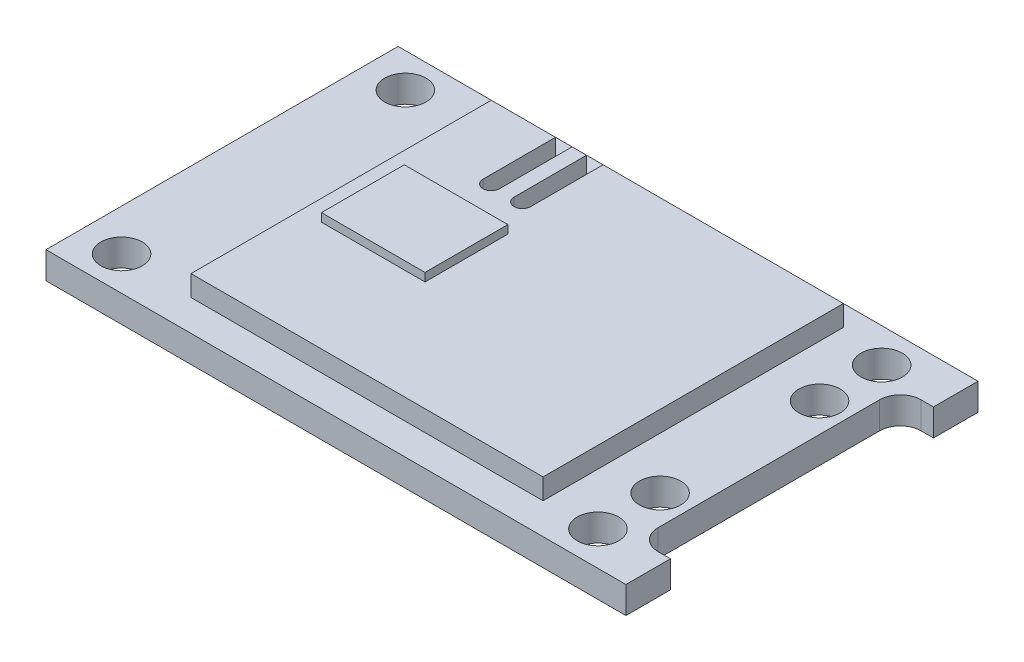
ISO-10303-21;
HEADER;
FILE_DESCRIPTION(('STEP AP214'),'2;1');
FILE_NAME('part.step','',(''),(''),'','','');
FILE_SCHEMA(('AUTOMOTIVE_DESIGN { 1 0 10303 214 1 1 1 1 }'));
ENDSEC;
DATA;
#1=APPLICATION_CONTEXT('core data for automotive mechanical design processes');
#2=APPLICATION_PROTOCOL_DEFINITION('international standard','automotive_design',2000,#1);
#3=PRODUCT_CONTEXT('',#1,'mechanical');
#4=PRODUCT('Part','Part','',(#3));
#5=PRODUCT_RELATED_PRODUCT_CATEGORY('part','',(#4));
#6=PRODUCT_DEFINITION_FORMATION('','',#4);
#7=PRODUCT_DEFINITION_CONTEXT('part definition',#1,'design');
#8=PRODUCT_DEFINITION('design','',#6,#7);
#9=PRODUCT_DEFINITION_SHAPE('','',#8);
#10=(LENGTH_UNIT() NAMED_UNIT(*) SI_UNIT(.MILLI.,.METRE.));
#11=(NAMED_UNIT(*) PLANE_ANGLE_UNIT() SI_UNIT($,.RADIAN.));
#12=(NAMED_UNIT(*) SI_UNIT($,.STERADIAN.) SOLID_ANGLE_UNIT());
#13=UNCERTAINTY_MEASURE_WITH_UNIT(LENGTH_MEASURE(1.E-05),#10,'distance_accuracy_value','');
#14=(GEOMETRIC_REPRESENTATION_CONTEXT(3) GLOBAL_UNCERTAINTY_ASSIGNED_CONTEXT((#13)) GLOBAL_UNIT_ASSIGNED_CONTEXT((#10,
#11,#12)) REPRESENTATION_CONTEXT('',''));
#15=CARTESIAN_POINT('',(0.,0.,0.));
#16=DIRECTION('',(0.,0.,1.));
#17=DIRECTION('',(1.,0.,0.));
#18=AXIS2_PLACEMENT_3D('',#15,#16,#17);
#19=CARTESIAN_POINT('',(-5.,2.3,-4.));
#20=DIRECTION('',(0.,1.,0.));
#21=DIRECTION('',(0.,0.,1.));
#22=AXIS2_PLACEMENT_3D('',#19,#20,#21);
#23=PLANE('',#22);
#24=DIRECTION('',(0.,0.,-1.));
#25=VECTOR('',#24,1.);
#26=CARTESIAN_POINT('',(8.50000000000001,2.3,-7.5));
#27=LINE('',#26,#25);
#28=CARTESIAN_POINT('',(8.5,2.3,7.));
#29=VERTEX_POINT('',#28);
#30=CARTESIAN_POINT('',(8.50000000000001,2.3,-7.5));
#31=VERTEX_POINT('',#30);
#32=EDGE_CURVE('E243',#29,#31,#27,.T.);
#33=ORIENTED_EDGE('',*,*,#32,.T.);
#34=DIRECTION('',(-1.,0.,0.));
#35=VECTOR('',#34,1.);
#36=CARTESIAN_POINT('',(-3.1,2.3,-7.5));
#37=LINE('',#36,#35);
#38=CARTESIAN_POINT('',(-3.1,2.3,-7.5));
#39=VERTEX_POINT('',#38);
#40=EDGE_CURVE('E246',#31,#39,#37,.T.);
#41=ORIENTED_EDGE('',*,*,#40,.T.);
#42=DIRECTION('',(0.,0.,1.));
#43=VECTOR('',#42,1.);
#44=CARTESIAN_POINT('',(-3.1,2.3,-4.));
#45=LINE('',#44,#43);
#46=CARTESIAN_POINT('',(-3.1,2.3,-4.));
#47=VERTEX_POINT('',#46);
#48=EDGE_CURVE('E249',#39,#47,#45,.T.);
#49=ORIENTED_EDGE('',*,*,#48,.T.);
#50=CARTESIAN_POINT('',(-3.5,2.3,-4.));
#51=DIRECTION('',(0.,-1.,0.));
#52=DIRECTION('',(0.,0.,1.));
#53=AXIS2_PLACEMENT_3D('',#50,#51,#52);
#54=CIRCLE('',#53,0.4);
#55=CARTESIAN_POINT('',(-3.9,2.3,-4.));
#56=VERTEX_POINT('',#55);
#57=EDGE_CURVE('E251',#47,#56,#54,.T.);
#58=ORIENTED_EDGE('',*,*,#57,.T.);
#59=DIRECTION('',(0.,0.,-1.));
#60=VECTOR('',#59,1.);
#61=CARTESIAN_POINT('',(-3.9,2.3,-4.));
#62=LINE('',#61,#60);
#63=CARTESIAN_POINT('',(-3.9,2.3,-7.5));
#64=VERTEX_POINT('',#63);
#65=EDGE_CURVE('E253',#56,#64,#62,.T.);
#66=ORIENTED_EDGE('',*,*,#65,.T.);
#67=DIRECTION('',(-1.,0.,0.));
#68=VECTOR('',#67,1.);
#69=CARTESIAN_POINT('',(-4.6,2.3,-7.5));
#70=LINE('',#69,#68);
#71=CARTESIAN_POINT('',(-4.6,2.3,-7.5));
#72=VERTEX_POINT('',#71);
#73=EDGE_CURVE('E255',#64,#72,#70,.T.);
#74=ORIENTED_EDGE('',*,*,#73,.T.);
#75=DIRECTION('',(0.,0.,1.));
#76=VECTOR('',#75,1.);
#77=CARTESIAN_POINT('',(-4.6,2.3,-4.));
#78=LINE('',#77,#76);
#79=CARTESIAN_POINT('',(-4.6,2.3,-4.));
#80=VERTEX_POINT('',#79);
#81=EDGE_CURVE('E257',#72,#80,#78,.T.);
#82=ORIENTED_EDGE('',*,*,#81,.T.);
#83=CARTESIAN_POINT('',(-5.,2.3,-4.));
#84=DIRECTION('',(0.,-1.,0.));
#85=DIRECTION('',(0.,0.,1.));
#86=AXIS2_PLACEMENT_3D('',#83,#84,#85);
#87=CIRCLE('',#86,0.400000000000001);
#88=CARTESIAN_POINT('',(-5.4,2.3,-4.));
#89=VERTEX_POINT('',#88);
#90=EDGE_CURVE('E259',#80,#89,#87,.T.);
#91=ORIENTED_EDGE('',*,*,#90,.T.);
#92=DIRECTION('',(0.,0.,-1.));
#93=VECTOR('',#92,1.);
#94=CARTESIAN_POINT('',(-5.4,2.3,-4.));
#95=LINE('',#94,#93);
#96=CARTESIAN_POINT('',(-5.4,2.3,-7.5));
#97=VERTEX_POINT('',#96);
#98=EDGE_CURVE('E261',#89,#97,#95,.T.);
#99=ORIENTED_EDGE('',*,*,#98,.T.);
#100=DIRECTION('',(-1.,0.,0.));
#101=VECTOR('',#100,1.);
#102=CARTESIAN_POINT('',(-8.5,2.3,-7.5));
#103=LINE('',#102,#101);
#104=CARTESIAN_POINT('',(-8.5,2.3,-7.5));
#105=VERTEX_POINT('',#104);
#106=EDGE_CURVE('E263',#97,#105,#103,.T.);
#107=ORIENTED_EDGE('',*,*,#106,.T.);
#108=DIRECTION('',(0.,0.,1.));
#109=VECTOR('',#108,1.);
#110=CARTESIAN_POINT('',(-8.5,2.3,-7.5));
#111=LINE('',#110,#109);
#112=CARTESIAN_POINT('',(-8.49999999999999,2.3,7.));
#113=VERTEX_POINT('',#112);
#114=EDGE_CURVE('E265',#105,#113,#111,.T.);
#115=ORIENTED_EDGE('',*,*,#114,.T.);
#116=DIRECTION('',(1.,0.,0.));
#117=VECTOR('',#116,1.);
#118=CARTESIAN_POINT('',(-8.49999999999999,2.3,7.));
#119=LINE('',#118,#117);
#120=EDGE_CURVE('E267',#113,#29,#119,.T.);
#121=ORIENTED_EDGE('',*,*,#120,.T.);
#122=EDGE_LOOP('',(#33,#41,#49,#58,#66,#74,#82,#91,#99,#107,#115,#121));
#123=FACE_BOUND('',#122,.T.);
#124=DIRECTION('',(-1.,0.,0.));
#125=VECTOR('',#124,1.);
#126=CARTESIAN_POINT('',(-7.5,2.3,-2.3));
#127=LINE('',#126,#125);
#128=CARTESIAN_POINT('',(-2.5,2.3,-2.3));
#129=VERTEX_POINT('',#128);
#130=CARTESIAN_POINT('',(-7.5,2.3,-2.3));
#131=VERTEX_POINT('',#130);
#132=EDGE_CURVE('E880',#129,#131,#127,.T.);
#133=ORIENTED_EDGE('',*,*,#132,.F.);
#134=DIRECTION('',(0.,0.,-1.));
#135=VECTOR('',#134,1.);
#136=CARTESIAN_POINT('',(-2.5,2.3,-2.3));
#137=LINE('',#136,#135);
#138=CARTESIAN_POINT('',(-2.5,2.3,1.7));
#139=VERTEX_POINT('',#138);
#140=EDGE_CURVE('E233',#139,#129,#137,.T.);
#141=ORIENTED_EDGE('',*,*,#140,.F.);
#142=DIRECTION('',(1.,0.,0.));
#143=VECTOR('',#142,1.);
#144=CARTESIAN_POINT('',(-7.5,2.3,1.7));
#145=LINE('',#144,#143);
#146=CARTESIAN_POINT('',(-7.5,2.3,1.7));
#147=VERTEX_POINT('',#146);
#148=EDGE_CURVE('E229',#147,#139,#145,.T.);
#149=ORIENTED_EDGE('',*,*,#148,.F.);
#150=DIRECTION('',(0.,0.,1.));
#151=VECTOR('',#150,1.);
#152=CARTESIAN_POINT('',(-7.5,2.3,-2.3));
#153=LINE('',#152,#151);
#154=EDGE_CURVE('E877',#131,#147,#153,.T.);
#155=ORIENTED_EDGE('',*,*,#154,.F.);
#156=EDGE_LOOP('',(#133,#141,#149,#155));
#157=FACE_BOUND('',#156,.T.);
#158=ADVANCED_FACE('F36',(#123,#157),#23,.T.);
#159=CARTESIAN_POINT('',(13.4,1.3,-5.35));
#160=DIRECTION('',(0.,1.,0.));
#161=DIRECTION('',(0.,0.,1.));
#162=AXIS2_PLACEMENT_3D('',#159,#160,#161);
#163=PLANE('',#162);
#164=CARTESIAN_POINT('',(-12.,1.3,-6.85));
#165=DIRECTION('',(0.,1.,0.));
#166=DIRECTION('',(0.,0.,1.));
#167=AXIS2_PLACEMENT_3D('',#164,#165,#166);
#168=CIRCLE('',#167,1.);
#169=CARTESIAN_POINT('',(-12.,1.3,-5.85));
#170=VERTEX_POINT('',#169);
#171=EDGE_CURVE('E333',#170,#170,#168,.T.);
#172=ORIENTED_EDGE('',*,*,#171,.F.);
#173=EDGE_LOOP('',(#172));
#174=FACE_BOUND('',#173,.T.);
#175=CARTESIAN_POINT('',(-12.,1.3,6.85));
#176=DIRECTION('',(0.,1.,0.));
#177=DIRECTION('',(0.,0.,1.));
#178=AXIS2_PLACEMENT_3D('',#175,#176,#177);
#179=CIRCLE('',#178,1.);
#180=CARTESIAN_POINT('',(-12.,1.3,7.85));
#181=VERTEX_POINT('',#180);
#182=EDGE_CURVE('E339',#181,#181,#179,.T.);
#183=ORIENTED_EDGE('',*,*,#182,.F.);
#184=EDGE_LOOP('',(#183));
#185=FACE_BOUND('',#184,.T.);
#186=CARTESIAN_POINT('',(11.,1.3,6.85));
#187=DIRECTION('',(0.,1.,0.));
#188=DIRECTION('',(0.,0.,1.));
#189=AXIS2_PLACEMENT_3D('',#186,#187,#188);
#190=CIRCLE('',#189,1.);
#191=CARTESIAN_POINT('',(11.,1.3,7.85));
#192=VERTEX_POINT('',#191);
#193=EDGE_CURVE('E345',#192,#192,#190,.T.);
#194=ORIENTED_EDGE('',*,*,#193,.F.);
#195=EDGE_LOOP('',(#194));
#196=FACE_BOUND('',#195,.T.);
#197=CARTESIAN_POINT('',(11.,1.3,3.85));
#198=DIRECTION('',(0.,1.,0.));
#199=DIRECTION('',(0.,0.,1.));
#200=AXIS2_PLACEMENT_3D('',#197,#198,#199);
#201=CIRCLE('',#200,1.);
#202=CARTESIAN_POINT('',(11.,1.3,4.85));
#203=VERTEX_POINT('',#202);
#204=EDGE_CURVE('E326',#203,#203,#201,.T.);
#205=ORIENTED_EDGE('',*,*,#204,.F.);
#206=EDGE_LOOP('',(#205));
#207=FACE_BOUND('',#206,.T.);
#208=CARTESIAN_POINT('',(11.,1.3,-3.85));
#209=DIRECTION('',(0.,1.,0.));
#210=DIRECTION('',(0.,0.,1.));
#211=AXIS2_PLACEMENT_3D('',#208,#209,#210);
#212=CIRCLE('',#211,1.);
#213=CARTESIAN_POINT('',(11.,1.3,-2.85));
#214=VERTEX_POINT('',#213);
#215=EDGE_CURVE('E322',#214,#214,#212,.T.);
#216=ORIENTED_EDGE('',*,*,#215,.F.);
#217=EDGE_LOOP('',(#216));
#218=FACE_BOUND('',#217,.T.);
#219=CARTESIAN_POINT('',(11.,1.3,-6.85));
#220=DIRECTION('',(0.,1.,0.));
#221=DIRECTION('',(0.,0.,1.));
#222=AXIS2_PLACEMENT_3D('',#219,#220,#221);
#223=CIRCLE('',#222,1.);
#224=CARTESIAN_POINT('',(11.,1.3,-5.85));
#225=VERTEX_POINT('',#224);
#226=EDGE_CURVE('E332',#225,#225,#223,.T.);
#227=ORIENTED_EDGE('',*,*,#226,.F.);
#228=EDGE_LOOP('',(#227));
#229=FACE_BOUND('',#228,.T.);
#230=DIRECTION('',(0.,0.,-1.));
#231=VECTOR('',#230,1.);
#232=CARTESIAN_POINT('',(14.,1.3,6.35));
#233=LINE('',#232,#231);
#234=CARTESIAN_POINT('',(14.,1.3,8.5));
#235=VERTEX_POINT('',#234);
#236=CARTESIAN_POINT('',(14.,1.3,6.35));
#237=VERTEX_POINT('',#236);
#238=EDGE_CURVE('E359',#235,#237,#233,.T.);
#239=ORIENTED_EDGE('',*,*,#238,.T.);
#240=DIRECTION('',(-1.,0.,0.));
#241=VECTOR('',#240,1.);
#242=CARTESIAN_POINT('',(13.4,1.3,6.35));
#243=LINE('',#242,#241);
#244=CARTESIAN_POINT('',(13.4,1.3,6.35));
#245=VERTEX_POINT('',#244);
#246=EDGE_CURVE('E362',#237,#245,#243,.T.);
#247=ORIENTED_EDGE('',*,*,#246,.T.);
#248=CARTESIAN_POINT('',(13.4,1.3,5.35));
#249=DIRECTION('',(0.,-1.,0.));
#250=DIRECTION('',(0.,0.,1.));
#251=AXIS2_PLACEMENT_3D('',#248,#249,#250);
#252=CIRCLE('',#251,1.);
#253=CARTESIAN_POINT('',(12.4,1.3,5.35));
#254=VERTEX_POINT('',#253);
#255=EDGE_CURVE('E365',#245,#254,#252,.T.);
#256=ORIENTED_EDGE('',*,*,#255,.T.);
#257=DIRECTION('',(0.,0.,-1.));
#258=VECTOR('',#257,1.);
#259=CARTESIAN_POINT('',(12.4,1.3,-5.35));
#260=LINE('',#259,#258);
#261=CARTESIAN_POINT('',(12.4,1.3,-5.35));
#262=VERTEX_POINT('',#261);
#263=EDGE_CURVE('E367',#254,#262,#260,.T.);
#264=ORIENTED_EDGE('',*,*,#263,.T.);
#265=CARTESIAN_POINT('',(13.4,1.3,-5.35));
#266=DIRECTION('',(0.,-1.,0.));
#267=DIRECTION('',(0.,0.,1.));
#268=AXIS2_PLACEMENT_3D('',#265,#266,#267);
#269=CIRCLE('',#268,1.);
#270=CARTESIAN_POINT('',(13.4,1.3,-6.35));
#271=VERTEX_POINT('',#270);
#272=EDGE_CURVE('E369',#262,#271,#269,.T.);
#273=ORIENTED_EDGE('',*,*,#272,.T.);
#274=DIRECTION('',(1.,0.,0.));
#275=VECTOR('',#274,1.);
#276=CARTESIAN_POINT('',(13.4,1.3,-6.35));
#277=LINE('',#276,#275);
#278=CARTESIAN_POINT('',(14.,1.3,-6.35));
#279=VERTEX_POINT('',#278);
#280=EDGE_CURVE('E371',#271,#279,#277,.T.);
#281=ORIENTED_EDGE('',*,*,#280,.T.);
#282=DIRECTION('',(0.,0.,-1.));
#283=VECTOR('',#282,1.);
#284=CARTESIAN_POINT('',(14.,1.3,-8.5));
#285=LINE('',#284,#283);
#286=CARTESIAN_POINT('',(14.,1.3,-8.5));
#287=VERTEX_POINT('',#286);
#288=EDGE_CURVE('E373',#279,#287,#285,.T.);
#289=ORIENTED_EDGE('',*,*,#288,.T.);
#290=DIRECTION('',(-1.,0.,0.));
#291=VECTOR('',#290,1.);
#292=CARTESIAN_POINT('',(-14.,1.3,-8.5));
#293=LINE('',#292,#291);
#294=CARTESIAN_POINT('',(-14.,1.3,-8.5));
#295=VERTEX_POINT('',#294);
#296=EDGE_CURVE('E375',#287,#295,#293,.T.);
#297=ORIENTED_EDGE('',*,*,#296,.T.);
#298=DIRECTION('',(0.,0.,1.));
#299=VECTOR('',#298,1.);
#300=CARTESIAN_POINT('',(-14.,1.3,-8.5));
#301=LINE('',#300,#299);
#302=CARTESIAN_POINT('',(-14.,1.3,8.5));
#303=VERTEX_POINT('',#302);
#304=EDGE_CURVE('E377',#295,#303,#301,.T.);
#305=ORIENTED_EDGE('',*,*,#304,.T.);
#306=DIRECTION('',(1.,0.,0.));
#307=VECTOR('',#306,1.);
#308=CARTESIAN_POINT('',(-14.,1.3,8.5));
#309=LINE('',#308,#307);
#310=EDGE_CURVE('E379',#303,#235,#309,.T.);
#311=ORIENTED_EDGE('',*,*,#310,.T.);
#312=EDGE_LOOP('',(#239,#247,#256,#264,#273,#281,#289,#297,#305,#311));
#313=FACE_BOUND('',#312,.T.);
#314=DIRECTION('',(-1.,0.,0.));
#315=VECTOR('',#314,1.);
#316=CARTESIAN_POINT('',(-3.1,1.3,-7.5));
#317=LINE('',#316,#315);
#318=CARTESIAN_POINT('',(8.50000000000001,1.3,-7.5));
#319=VERTEX_POINT('',#318);
#320=CARTESIAN_POINT('',(-3.1,1.3,-7.5));
#321=VERTEX_POINT('',#320);
#322=EDGE_CURVE('E238',#319,#321,#317,.T.);
#323=ORIENTED_EDGE('',*,*,#322,.F.);
#324=DIRECTION('',(0.,0.,-1.));
#325=VECTOR('',#324,1.);
#326=CARTESIAN_POINT('',(8.50000000000001,1.3,-7.5));
#327=LINE('',#326,#325);
#328=CARTESIAN_POINT('',(8.5,1.3,7.));
#329=VERTEX_POINT('',#328);
#330=EDGE_CURVE('E235',#329,#319,#327,.T.);
#331=ORIENTED_EDGE('',*,*,#330,.F.);
#332=DIRECTION('',(1.,0.,0.));
#333=VECTOR('',#332,1.);
#334=CARTESIAN_POINT('',(-8.49999999999999,1.3,7.));
#335=LINE('',#334,#333);
#336=CARTESIAN_POINT('',(-8.49999999999999,1.3,7.));
#337=VERTEX_POINT('',#336);
#338=EDGE_CURVE('E247',#337,#329,#335,.T.);
#339=ORIENTED_EDGE('',*,*,#338,.F.);
#340=DIRECTION('',(0.,0.,1.));
#341=VECTOR('',#340,1.);
#342=CARTESIAN_POINT('',(-8.5,1.3,-7.5));
#343=LINE('',#342,#341);
#344=CARTESIAN_POINT('',(-8.5,1.3,-7.5));
#345=VERTEX_POINT('',#344);
#346=EDGE_CURVE('E287',#345,#337,#343,.T.);
#347=ORIENTED_EDGE('',*,*,#346,.F.);
#348=DIRECTION('',(-1.,0.,0.));
#349=VECTOR('',#348,1.);
#350=CARTESIAN_POINT('',(-8.5,1.3,-7.5));
#351=LINE('',#350,#349);
#352=CARTESIAN_POINT('',(-5.4,1.3,-7.5));
#353=VERTEX_POINT('',#352);
#354=EDGE_CURVE('E285',#353,#345,#351,.T.);
#355=ORIENTED_EDGE('',*,*,#354,.F.);
#356=DIRECTION('',(0.,0.,-1.));
#357=VECTOR('',#356,1.);
#358=CARTESIAN_POINT('',(-5.4,1.3,-4.));
#359=LINE('',#358,#357);
#360=CARTESIAN_POINT('',(-5.4,1.3,-4.));
#361=VERTEX_POINT('',#360);
#362=EDGE_CURVE('E283',#361,#353,#359,.T.);
#363=ORIENTED_EDGE('',*,*,#362,.F.);
#364=CARTESIAN_POINT('',(-5.,1.3,-4.));
#365=DIRECTION('',(0.,-1.,0.));
#366=DIRECTION('',(0.,0.,1.));
#367=AXIS2_PLACEMENT_3D('',#364,#365,#366);
#368=CIRCLE('',#367,0.400000000000001);
#369=CARTESIAN_POINT('',(-4.6,1.3,-4.));
#370=VERTEX_POINT('',#369);
#371=EDGE_CURVE('E281',#370,#361,#368,.T.);
#372=ORIENTED_EDGE('',*,*,#371,.F.);
#373=DIRECTION('',(0.,0.,1.));
#374=VECTOR('',#373,1.);
#375=CARTESIAN_POINT('',(-4.6,1.3,-4.));
#376=LINE('',#375,#374);
#377=CARTESIAN_POINT('',(-4.6,1.3,-7.5));
#378=VERTEX_POINT('',#377);
#379=EDGE_CURVE('E279',#378,#370,#376,.T.);
#380=ORIENTED_EDGE('',*,*,#379,.F.);
#381=DIRECTION('',(-1.,0.,0.));
#382=VECTOR('',#381,1.);
#383=CARTESIAN_POINT('',(-4.6,1.3,-7.5));
#384=LINE('',#383,#382);
#385=CARTESIAN_POINT('',(-3.9,1.3,-7.5));
#386=VERTEX_POINT('',#385);
#387=EDGE_CURVE('E277',#386,#378,#384,.T.);
#388=ORIENTED_EDGE('',*,*,#387,.F.);
#389=DIRECTION('',(0.,0.,-1.));
#390=VECTOR('',#389,1.);
#391=CARTESIAN_POINT('',(-3.9,1.3,-4.));
#392=LINE('',#391,#390);
#393=CARTESIAN_POINT('',(-3.9,1.3,-4.));
#394=VERTEX_POINT('',#393);
#395=EDGE_CURVE('E275',#394,#386,#392,.T.);
#396=ORIENTED_EDGE('',*,*,#395,.F.);
#397=CARTESIAN_POINT('',(-3.5,1.3,-4.));
#398=DIRECTION('',(0.,-1.,0.));
#399=DIRECTION('',(0.,0.,1.));
#400=AXIS2_PLACEMENT_3D('',#397,#398,#399);
#401=CIRCLE('',#400,0.4);
#402=CARTESIAN_POINT('',(-3.1,1.3,-4.));
#403=VERTEX_POINT('',#402);
#404=EDGE_CURVE('E273',#403,#394,#401,.T.);
#405=ORIENTED_EDGE('',*,*,#404,.F.);
#406=DIRECTION('',(0.,0.,1.));
#407=VECTOR('',#406,1.);
#408=CARTESIAN_POINT('',(-3.1,1.3,-4.));
#409=LINE('',#408,#407);
#410=EDGE_CURVE('E271',#321,#403,#409,.T.);
#411=ORIENTED_EDGE('',*,*,#410,.F.);
#412=EDGE_LOOP('',(#323,#331,#339,#347,#355,#363,#372,#380,#388,#396,#405,#411));
#413=FACE_BOUND('',#412,.T.);
#414=ADVANCED_FACE('F447',(#174,#185,#196,#207,#218,#229,#313,#413),#163,.T.);
#415=CARTESIAN_POINT('',(14.,1.3,6.35));
#416=DIRECTION('',(-1.,0.,0.));
#417=DIRECTION('',(0.,0.,1.));
#418=AXIS2_PLACEMENT_3D('',#415,#416,#417);
#419=PLANE('',#418);
#420=DIRECTION('',(0.,0.,-1.));
#421=VECTOR('',#420,1.);
#422=CARTESIAN_POINT('',(14.,0.,6.35));
#423=LINE('',#422,#421);
#424=CARTESIAN_POINT('',(14.,0.,8.5));
#425=VERTEX_POINT('',#424);
#426=CARTESIAN_POINT('',(14.,0.,6.35));
#427=VERTEX_POINT('',#426);
#428=EDGE_CURVE('E356',#425,#427,#423,.T.);
#429=ORIENTED_EDGE('',*,*,#428,.T.);
#430=DIRECTION('',(0.,-1.,0.));
#431=VECTOR('',#430,1.);
#432=CARTESIAN_POINT('',(14.,1.3,6.35));
#433=LINE('',#432,#431);
#434=EDGE_CURVE('E11',#237,#427,#433,.T.);
#435=ORIENTED_EDGE('',*,*,#434,.F.);
#436=ORIENTED_EDGE('',*,*,#238,.F.);
#437=DIRECTION('',(0.,-1.,0.));
#438=VECTOR('',#437,1.);
#439=CARTESIAN_POINT('',(14.,1.3,8.5));
#440=LINE('',#439,#438);
#441=EDGE_CURVE('E381',#235,#425,#440,.T.);
#442=ORIENTED_EDGE('',*,*,#441,.T.);
#443=EDGE_LOOP('',(#429,#435,#436,#442));
#444=FACE_BOUND('',#443,.T.);
#445=ADVANCED_FACE('F38',(#444),#419,.F.);
#446=CARTESIAN_POINT('',(13.4,1.3,6.35));
#447=DIRECTION('',(0.,0.,1.));
#448=DIRECTION('',(1.,0.,0.));
#449=AXIS2_PLACEMENT_3D('',#446,#447,#448);
#450=PLANE('',#449);
#451=DIRECTION('',(-1.,0.,0.));
#452=VECTOR('',#451,1.);
#453=CARTESIAN_POINT('',(13.4,0.,6.35));
#454=LINE('',#453,#452);
#455=CARTESIAN_POINT('',(13.4,0.,6.35));
#456=VERTEX_POINT('',#455);
#457=EDGE_CURVE('E384',#427,#456,#454,.T.);
#458=ORIENTED_EDGE('',*,*,#457,.T.);
#459=DIRECTION('',(0.,-1.,0.));
#460=VECTOR('',#459,1.);
#461=CARTESIAN_POINT('',(13.4,1.3,6.35));
#462=LINE('',#461,#460);
#463=EDGE_CURVE('E44',#245,#456,#462,.T.);
#464=ORIENTED_EDGE('',*,*,#463,.F.);
#465=ORIENTED_EDGE('',*,*,#246,.F.);
#466=ORIENTED_EDGE('',*,*,#434,.T.);
#467=EDGE_LOOP('',(#458,#464,#465,#466));
#468=FACE_BOUND('',#467,.T.);
#469=ADVANCED_FACE('F452',(#468),#450,.F.);
#470=CARTESIAN_POINT('',(13.4,1.3,5.35));
#471=DIRECTION('',(0.,-1.,0.));
#472=DIRECTION('',(0.,0.,-1.));
#473=AXIS2_PLACEMENT_3D('',#470,#471,#472);
#474=CYLINDRICAL_SURFACE('',#473,1.);
#475=CARTESIAN_POINT('',(13.4,0.,5.35));
#476=DIRECTION('',(0.,-1.,0.));
#477=DIRECTION('',(0.,0.,1.));
#478=AXIS2_PLACEMENT_3D('',#475,#476,#477);
#479=CIRCLE('',#478,1.);
#480=CARTESIAN_POINT('',(12.4,0.,5.35));
#481=VERTEX_POINT('',#480);
#482=EDGE_CURVE('E386',#456,#481,#479,.T.);
#483=ORIENTED_EDGE('',*,*,#482,.T.);
#484=DIRECTION('',(0.,-1.,0.));
#485=VECTOR('',#484,1.);
#486=CARTESIAN_POINT('',(12.4,1.3,5.35));
#487=LINE('',#486,#485);
#488=EDGE_CURVE('E421',#254,#481,#487,.T.);
#489=ORIENTED_EDGE('',*,*,#488,.F.);
#490=ORIENTED_EDGE('',*,*,#255,.F.);
#491=ORIENTED_EDGE('',*,*,#463,.T.);
#492=EDGE_LOOP('',(#483,#489,#490,#491));
#493=FACE_BOUND('',#492,.T.);
#494=ADVANCED_FACE('F428',(#493),#474,.F.);
#495=CARTESIAN_POINT('',(12.4,1.3,-5.35));
#496=DIRECTION('',(-1.,0.,0.));
#497=DIRECTION('',(0.,0.,1.));
#498=AXIS2_PLACEMENT_3D('',#495,#496,#497);
#499=PLANE('',#498);
#500=DIRECTION('',(0.,0.,-1.));
#501=VECTOR('',#500,1.);
#502=CARTESIAN_POINT('',(12.4,0.,-5.35));
#503=LINE('',#502,#501);
#504=CARTESIAN_POINT('',(12.4,0.,-5.35));
#505=VERTEX_POINT('',#504);
#506=EDGE_CURVE('E388',#481,#505,#503,.T.);
#507=ORIENTED_EDGE('',*,*,#506,.T.);
#508=DIRECTION('',(0.,-1.,0.));
#509=VECTOR('',#508,1.);
#510=CARTESIAN_POINT('',(12.4,1.3,-5.35));
#511=LINE('',#510,#509);
#512=EDGE_CURVE('E418',#262,#505,#511,.T.);
#513=ORIENTED_EDGE('',*,*,#512,.F.);
#514=ORIENTED_EDGE('',*,*,#263,.F.);
#515=ORIENTED_EDGE('',*,*,#488,.T.);
#516=EDGE_LOOP('',(#507,#513,#514,#515));
#517=FACE_BOUND('',#516,.T.);
#518=ADVANCED_FACE('F439',(#517),#499,.F.);
#519=CARTESIAN_POINT('',(13.4,1.3,-5.35));
#520=DIRECTION('',(0.,-1.,0.));
#521=DIRECTION('',(0.,0.,-1.));
#522=AXIS2_PLACEMENT_3D('',#519,#520,#521);
#523=CYLINDRICAL_SURFACE('',#522,1.);
#524=CARTESIAN_POINT('',(13.4,0.,-5.35));
#525=DIRECTION('',(0.,-1.,0.));
#526=DIRECTION('',(0.,0.,1.));
#527=AXIS2_PLACEMENT_3D('',#524,#525,#526);
#528=CIRCLE('',#527,1.);
#529=CARTESIAN_POINT('',(13.4,0.,-6.35));
#530=VERTEX_POINT('',#529);
#531=EDGE_CURVE('E390',#505,#530,#528,.T.);
#532=ORIENTED_EDGE('',*,*,#531,.T.);
#533=DIRECTION('',(0.,-1.,0.));
#534=VECTOR('',#533,1.);
#535=CARTESIAN_POINT('',(13.4,1.3,-6.35));
#536=LINE('',#535,#534);
#537=EDGE_CURVE('E415',#271,#530,#536,.T.);
#538=ORIENTED_EDGE('',*,*,#537,.F.);
#539=ORIENTED_EDGE('',*,*,#272,.F.);
#540=ORIENTED_EDGE('',*,*,#512,.T.);
#541=EDGE_LOOP('',(#532,#538,#539,#540));
#542=FACE_BOUND('',#541,.T.);
#543=ADVANCED_FACE('F443',(#542),#523,.F.);
#544=CARTESIAN_POINT('',(13.4,1.3,-6.35));
#545=DIRECTION('',(0.,0.,-1.));
#546=DIRECTION('',(-1.,0.,0.));
#547=AXIS2_PLACEMENT_3D('',#544,#545,#546);
#548=PLANE('',#547);
#549=DIRECTION('',(1.,0.,0.));
#550=VECTOR('',#549,1.);
#551=CARTESIAN_POINT('',(13.4,0.,-6.35));
#552=LINE('',#551,#550);
#553=CARTESIAN_POINT('',(14.,0.,-6.35));
#554=VERTEX_POINT('',#553);
#555=EDGE_CURVE('E392',#530,#554,#552,.T.);
#556=ORIENTED_EDGE('',*,*,#555,.T.);
#557=DIRECTION('',(0.,-1.,0.));
#558=VECTOR('',#557,1.);
#559=CARTESIAN_POINT('',(14.,1.3,-6.35));
#560=LINE('',#559,#558);
#561=EDGE_CURVE('E412',#279,#554,#560,.T.);
#562=ORIENTED_EDGE('',*,*,#561,.F.);
#563=ORIENTED_EDGE('',*,*,#280,.F.);
#564=ORIENTED_EDGE('',*,*,#537,.T.);
#565=EDGE_LOOP('',(#556,#562,#563,#564));
#566=FACE_BOUND('',#565,.T.);
#567=ADVANCED_FACE('F475',(#566),#548,.F.);
#568=CARTESIAN_POINT('',(14.,1.3,-8.5));
#569=DIRECTION('',(-1.,0.,0.));
#570=DIRECTION('',(0.,0.,1.));
#571=AXIS2_PLACEMENT_3D('',#568,#569,#570);
#572=PLANE('',#571);
#573=DIRECTION('',(0.,0.,-1.));
#574=VECTOR('',#573,1.);
#575=CARTESIAN_POINT('',(14.,0.,-8.5));
#576=LINE('',#575,#574);
#577=CARTESIAN_POINT('',(14.,0.,-8.5));
#578=VERTEX_POINT('',#577);
#579=EDGE_CURVE('E394',#554,#578,#576,.T.);
#580=ORIENTED_EDGE('',*,*,#579,.T.);
#581=DIRECTION('',(0.,-1.,0.));
#582=VECTOR('',#581,1.);
#583=CARTESIAN_POINT('',(14.,1.3,-8.5));
#584=LINE('',#583,#582);
#585=EDGE_CURVE('E409',#287,#578,#584,.T.);
#586=ORIENTED_EDGE('',*,*,#585,.F.);
#587=ORIENTED_EDGE('',*,*,#288,.F.);
#588=ORIENTED_EDGE('',*,*,#561,.T.);
#589=EDGE_LOOP('',(#580,#586,#587,#588));
#590=FACE_BOUND('',#589,.T.);
#591=ADVANCED_FACE('F472',(#590),#572,.F.);
#592=CARTESIAN_POINT('',(-14.,1.3,-8.5));
#593=DIRECTION('',(0.,0.,1.));
#594=DIRECTION('',(1.,0.,0.));
#595=AXIS2_PLACEMENT_3D('',#592,#593,#594);
#596=PLANE('',#595);
#597=DIRECTION('',(-1.,0.,0.));
#598=VECTOR('',#597,1.);
#599=CARTESIAN_POINT('',(-14.,0.,-8.5));
#600=LINE('',#599,#598);
#601=CARTESIAN_POINT('',(-14.,0.,-8.5));
#602=VERTEX_POINT('',#601);
#603=EDGE_CURVE('E396',#578,#602,#600,.T.);
#604=ORIENTED_EDGE('',*,*,#603,.T.);
#605=DIRECTION('',(0.,-1.,0.));
#606=VECTOR('',#605,1.);
#607=CARTESIAN_POINT('',(-14.,1.3,-8.5));
#608=LINE('',#607,#606);
#609=EDGE_CURVE('E406',#295,#602,#608,.T.);
#610=ORIENTED_EDGE('',*,*,#609,.F.);
#611=ORIENTED_EDGE('',*,*,#296,.F.);
#612=ORIENTED_EDGE('',*,*,#585,.T.);
#613=EDGE_LOOP('',(#604,#610,#611,#612));
#614=FACE_BOUND('',#613,.T.);
#615=ADVANCED_FACE('F468',(#614),#596,.F.);
#616=CARTESIAN_POINT('',(-14.,1.3,-8.5));
#617=DIRECTION('',(1.,0.,0.));
#618=DIRECTION('',(0.,0.,-1.));
#619=AXIS2_PLACEMENT_3D('',#616,#617,#618);
#620=PLANE('',#619);
#621=DIRECTION('',(0.,0.,1.));
#622=VECTOR('',#621,1.);
#623=CARTESIAN_POINT('',(-14.,0.,-8.5));
#624=LINE('',#623,#622);
#625=CARTESIAN_POINT('',(-14.,0.,8.5));
#626=VERTEX_POINT('',#625);
#627=EDGE_CURVE('E398',#602,#626,#624,.T.);
#628=ORIENTED_EDGE('',*,*,#627,.T.);
#629=DIRECTION('',(0.,-1.,0.));
#630=VECTOR('',#629,1.);
#631=CARTESIAN_POINT('',(-14.,1.3,8.5));
#632=LINE('',#631,#630);
#633=EDGE_CURVE('E403',#303,#626,#632,.T.);
#634=ORIENTED_EDGE('',*,*,#633,.F.);
#635=ORIENTED_EDGE('',*,*,#304,.F.);
#636=ORIENTED_EDGE('',*,*,#609,.T.);
#637=EDGE_LOOP('',(#628,#634,#635,#636));
#638=FACE_BOUND('',#637,.T.);
#639=ADVANCED_FACE('F464',(#638),#620,.F.);
#640=CARTESIAN_POINT('',(-14.,1.3,8.5));
#641=DIRECTION('',(0.,0.,-1.));
#642=DIRECTION('',(-1.,0.,0.));
#643=AXIS2_PLACEMENT_3D('',#640,#641,#642);
#644=PLANE('',#643);
#645=DIRECTION('',(1.,0.,0.));
#646=VECTOR('',#645,1.);
#647=CARTESIAN_POINT('',(-14.,0.,8.5));
#648=LINE('',#647,#646);
#649=EDGE_CURVE('E363',#626,#425,#648,.T.);
#650=ORIENTED_EDGE('',*,*,#649,.T.);
#651=ORIENTED_EDGE('',*,*,#441,.F.);
#652=ORIENTED_EDGE('',*,*,#310,.F.);
#653=ORIENTED_EDGE('',*,*,#633,.T.);
#654=EDGE_LOOP('',(#650,#651,#652,#653));
#655=FACE_BOUND('',#654,.T.);
#656=ADVANCED_FACE('F459',(#655),#644,.F.);
#657=CARTESIAN_POINT('',(13.4,0.,-5.35));
#658=DIRECTION('',(0.,1.,0.));
#659=DIRECTION('',(0.,0.,1.));
#660=AXIS2_PLACEMENT_3D('',#657,#658,#659);
#661=PLANE('',#660);
#662=CARTESIAN_POINT('',(-12.,0.,-6.85));
#663=DIRECTION('',(0.,1.,0.));
#664=DIRECTION('',(0.,0.,1.));
#665=AXIS2_PLACEMENT_3D('',#662,#663,#664);
#666=CIRCLE('',#665,1.);
#667=CARTESIAN_POINT('',(-12.,0.,-5.85));
#668=VERTEX_POINT('',#667);
#669=EDGE_CURVE('E329',#668,#668,#666,.T.);
#670=ORIENTED_EDGE('',*,*,#669,.T.);
#671=EDGE_LOOP('',(#670));
#672=FACE_BOUND('',#671,.T.);
#673=CARTESIAN_POINT('',(-12.,0.,6.85));
#674=DIRECTION('',(0.,1.,0.));
#675=DIRECTION('',(0.,0.,1.));
#676=AXIS2_PLACEMENT_3D('',#673,#674,#675);
#677=CIRCLE('',#676,1.);
#678=CARTESIAN_POINT('',(-12.,0.,7.85));
#679=VERTEX_POINT('',#678);
#680=EDGE_CURVE('E336',#679,#679,#677,.T.);
#681=ORIENTED_EDGE('',*,*,#680,.T.);
#682=EDGE_LOOP('',(#681));
#683=FACE_BOUND('',#682,.T.);
#684=CARTESIAN_POINT('',(11.,0.,6.85));
#685=DIRECTION('',(0.,1.,0.));
#686=DIRECTION('',(0.,0.,1.));
#687=AXIS2_PLACEMENT_3D('',#684,#685,#686);
#688=CIRCLE('',#687,1.);
#689=CARTESIAN_POINT('',(11.,0.,7.85));
#690=VERTEX_POINT('',#689);
#691=EDGE_CURVE('E342',#690,#690,#688,.T.);
#692=ORIENTED_EDGE('',*,*,#691,.T.);
#693=EDGE_LOOP('',(#692));
#694=FACE_BOUND('',#693,.T.);
#695=CARTESIAN_POINT('',(11.,0.,3.85));
#696=DIRECTION('',(0.,1.,0.));
#697=DIRECTION('',(0.,0.,1.));
#698=AXIS2_PLACEMENT_3D('',#695,#696,#697);
#699=CIRCLE('',#698,1.);
#700=CARTESIAN_POINT('',(11.,0.,4.85));
#701=VERTEX_POINT('',#700);
#702=EDGE_CURVE('E348',#701,#701,#699,.T.);
#703=ORIENTED_EDGE('',*,*,#702,.T.);
#704=EDGE_LOOP('',(#703));
#705=FACE_BOUND('',#704,.T.);
#706=CARTESIAN_POINT('',(11.,0.,-3.85));
#707=DIRECTION('',(0.,1.,0.));
#708=DIRECTION('',(0.,0.,1.));
#709=AXIS2_PLACEMENT_3D('',#706,#707,#708);
#710=CIRCLE('',#709,1.);
#711=CARTESIAN_POINT('',(11.,0.,-2.85));
#712=VERTEX_POINT('',#711);
#713=EDGE_CURVE('E323',#712,#712,#710,.T.);
#714=ORIENTED_EDGE('',*,*,#713,.T.);
#715=EDGE_LOOP('',(#714));
#716=FACE_BOUND('',#715,.T.);
#717=CARTESIAN_POINT('',(11.,0.,-6.85));
#718=DIRECTION('',(0.,1.,0.));
#719=DIRECTION('',(0.,0.,1.));
#720=AXIS2_PLACEMENT_3D('',#717,#718,#719);
#721=CIRCLE('',#720,1.);
#722=CARTESIAN_POINT('',(11.,0.,-5.85));
#723=VERTEX_POINT('',#722);
#724=EDGE_CURVE('E353',#723,#723,#721,.T.);
#725=ORIENTED_EDGE('',*,*,#724,.T.);
#726=EDGE_LOOP('',(#725));
#727=FACE_BOUND('',#726,.T.);
#728=ORIENTED_EDGE('',*,*,#428,.F.);
#729=ORIENTED_EDGE('',*,*,#649,.F.);
#730=ORIENTED_EDGE('',*,*,#627,.F.);
#731=ORIENTED_EDGE('',*,*,#603,.F.);
#732=ORIENTED_EDGE('',*,*,#579,.F.);
#733=ORIENTED_EDGE('',*,*,#555,.F.);
#734=ORIENTED_EDGE('',*,*,#531,.F.);
#735=ORIENTED_EDGE('',*,*,#506,.F.);
#736=ORIENTED_EDGE('',*,*,#482,.F.);
#737=ORIENTED_EDGE('',*,*,#457,.F.);
#738=EDGE_LOOP('',(#728,#729,#730,#731,#732,#733,#734,#735,#736,#737));
#739=FACE_BOUND('',#738,.T.);
#740=ADVANCED_FACE('F434',(#672,#683,#694,#705,#716,#727,#739),#661,.F.);
#741=CARTESIAN_POINT('',(11.,0.,-6.85));
#742=DIRECTION('',(0.,1.,0.));
#743=DIRECTION('',(0.,0.,1.));
#744=AXIS2_PLACEMENT_3D('',#741,#742,#743);
#745=CYLINDRICAL_SURFACE('',#744,1.);
#746=ORIENTED_EDGE('',*,*,#724,.F.);
#747=EDGE_LOOP('',(#746));
#748=FACE_BOUND('',#747,.T.);
#749=ORIENTED_EDGE('',*,*,#226,.T.);
#750=EDGE_LOOP('',(#749));
#751=FACE_BOUND('',#750,.T.);
#752=ADVANCED_FACE('F548',(#748,#751),#745,.F.);
#753=CARTESIAN_POINT('',(11.,0.,-3.85));
#754=DIRECTION('',(0.,1.,0.));
#755=DIRECTION('',(0.,0.,1.));
#756=AXIS2_PLACEMENT_3D('',#753,#754,#755);
#757=CYLINDRICAL_SURFACE('',#756,1.);
#758=ORIENTED_EDGE('',*,*,#713,.F.);
#759=EDGE_LOOP('',(#758));
#760=FACE_BOUND('',#759,.T.);
#761=ORIENTED_EDGE('',*,*,#215,.T.);
#762=EDGE_LOOP('',(#761));
#763=FACE_BOUND('',#762,.T.);
#764=ADVANCED_FACE('F544',(#760,#763),#757,.F.);
#765=CARTESIAN_POINT('',(11.,0.,3.85));
#766=DIRECTION('',(0.,1.,0.));
#767=DIRECTION('',(0.,0.,1.));
#768=AXIS2_PLACEMENT_3D('',#765,#766,#767);
#769=CYLINDRICAL_SURFACE('',#768,1.);
#770=ORIENTED_EDGE('',*,*,#702,.F.);
#771=EDGE_LOOP('',(#770));
#772=FACE_BOUND('',#771,.T.);
#773=ORIENTED_EDGE('',*,*,#204,.T.);
#774=EDGE_LOOP('',(#773));
#775=FACE_BOUND('',#774,.T.);
#776=ADVANCED_FACE('F547',(#772,#775),#769,.F.);
#777=CARTESIAN_POINT('',(11.,0.,6.85));
#778=DIRECTION('',(0.,1.,0.));
#779=DIRECTION('',(0.,0.,1.));
#780=AXIS2_PLACEMENT_3D('',#777,#778,#779);
#781=CYLINDRICAL_SURFACE('',#780,1.);
#782=ORIENTED_EDGE('',*,*,#691,.F.);
#783=EDGE_LOOP('',(#782));
#784=FACE_BOUND('',#783,.T.);
#785=ORIENTED_EDGE('',*,*,#193,.T.);
#786=EDGE_LOOP('',(#785));
#787=FACE_BOUND('',#786,.T.);
#788=ADVANCED_FACE('F556',(#784,#787),#781,.F.);
#789=CARTESIAN_POINT('',(-12.,0.,6.85));
#790=DIRECTION('',(0.,1.,0.));
#791=DIRECTION('',(0.,0.,1.));
#792=AXIS2_PLACEMENT_3D('',#789,#790,#791);
#793=CYLINDRICAL_SURFACE('',#792,1.);
#794=ORIENTED_EDGE('',*,*,#680,.F.);
#795=EDGE_LOOP('',(#794));
#796=FACE_BOUND('',#795,.T.);
#797=ORIENTED_EDGE('',*,*,#182,.T.);
#798=EDGE_LOOP('',(#797));
#799=FACE_BOUND('',#798,.T.);
#800=ADVANCED_FACE('F552',(#796,#799),#793,.F.);
#801=CARTESIAN_POINT('',(-12.,0.,-6.85));
#802=DIRECTION('',(0.,1.,0.));
#803=DIRECTION('',(0.,0.,1.));
#804=AXIS2_PLACEMENT_3D('',#801,#802,#803);
#805=CYLINDRICAL_SURFACE('',#804,1.);
#806=ORIENTED_EDGE('',*,*,#669,.F.);
#807=EDGE_LOOP('',(#806));
#808=FACE_BOUND('',#807,.T.);
#809=ORIENTED_EDGE('',*,*,#171,.T.);
#810=EDGE_LOOP('',(#809));
#811=FACE_BOUND('',#810,.T.);
#812=ADVANCED_FACE('F542',(#808,#811),#805,.F.);
#813=CARTESIAN_POINT('',(8.50000000000001,2.3,-7.5));
#814=DIRECTION('',(-1.,0.,0.));
#815=DIRECTION('',(0.,0.,1.));
#816=AXIS2_PLACEMENT_3D('',#813,#814,#815);
#817=PLANE('',#816);
#818=ORIENTED_EDGE('',*,*,#330,.T.);
#819=DIRECTION('',(0.,-1.,0.));
#820=VECTOR('',#819,1.);
#821=CARTESIAN_POINT('',(8.50000000000001,2.3,-7.5));
#822=LINE('',#821,#820);
#823=EDGE_CURVE('E320',#31,#319,#822,.T.);
#824=ORIENTED_EDGE('',*,*,#823,.F.);
#825=ORIENTED_EDGE('',*,*,#32,.F.);
#826=DIRECTION('',(0.,-1.,0.));
#827=VECTOR('',#826,1.);
#828=CARTESIAN_POINT('',(8.5,2.3,7.));
#829=LINE('',#828,#827);
#830=EDGE_CURVE('E268',#29,#329,#829,.T.);
#831=ORIENTED_EDGE('',*,*,#830,.T.);
#832=EDGE_LOOP('',(#818,#824,#825,#831));
#833=FACE_BOUND('',#832,.T.);
#834=ADVANCED_FACE('F538',(#833),#817,.F.);
#835=CARTESIAN_POINT('',(-3.1,2.3,-7.5));
#836=DIRECTION('',(0.,0.,1.));
#837=DIRECTION('',(1.,0.,0.));
#838=AXIS2_PLACEMENT_3D('',#835,#836,#837);
#839=PLANE('',#838);
#840=ORIENTED_EDGE('',*,*,#322,.T.);
#841=DIRECTION('',(0.,-1.,0.));
#842=VECTOR('',#841,1.);
#843=CARTESIAN_POINT('',(-3.1,2.3,-7.5));
#844=LINE('',#843,#842);
#845=EDGE_CURVE('E317',#39,#321,#844,.T.);
#846=ORIENTED_EDGE('',*,*,#845,.F.);
#847=ORIENTED_EDGE('',*,*,#40,.F.);
#848=ORIENTED_EDGE('',*,*,#823,.T.);
#849=EDGE_LOOP('',(#840,#846,#847,#848));
#850=FACE_BOUND('',#849,.T.);
#851=ADVANCED_FACE('F534',(#850),#839,.F.);
#852=CARTESIAN_POINT('',(-3.1,2.3,-4.));
#853=DIRECTION('',(1.,0.,0.));
#854=DIRECTION('',(0.,0.,-1.));
#855=AXIS2_PLACEMENT_3D('',#852,#853,#854);
#856=PLANE('',#855);
#857=ORIENTED_EDGE('',*,*,#410,.T.);
#858=DIRECTION('',(0.,-1.,0.));
#859=VECTOR('',#858,1.);
#860=CARTESIAN_POINT('',(-3.1,2.3,-4.));
#861=LINE('',#860,#859);
#862=EDGE_CURVE('E314',#47,#403,#861,.T.);
#863=ORIENTED_EDGE('',*,*,#862,.F.);
#864=ORIENTED_EDGE('',*,*,#48,.F.);
#865=ORIENTED_EDGE('',*,*,#845,.T.);
#866=EDGE_LOOP('',(#857,#863,#864,#865));
#867=FACE_BOUND('',#866,.T.);
#868=ADVANCED_FACE('F530',(#867),#856,.F.);
#869=CARTESIAN_POINT('',(-3.5,2.3,-4.));
#870=DIRECTION('',(0.,-1.,0.));
#871=DIRECTION('',(0.,0.,-1.));
#872=AXIS2_PLACEMENT_3D('',#869,#870,#871);
#873=CYLINDRICAL_SURFACE('',#872,0.4);
#874=ORIENTED_EDGE('',*,*,#404,.T.);
#875=DIRECTION('',(0.,-1.,0.));
#876=VECTOR('',#875,1.);
#877=CARTESIAN_POINT('',(-3.9,2.3,-4.));
#878=LINE('',#877,#876);
#879=EDGE_CURVE('E311',#56,#394,#878,.T.);
#880=ORIENTED_EDGE('',*,*,#879,.F.);
#881=ORIENTED_EDGE('',*,*,#57,.F.);
#882=ORIENTED_EDGE('',*,*,#862,.T.);
#883=EDGE_LOOP('',(#874,#880,#881,#882));
#884=FACE_BOUND('',#883,.T.);
#885=ADVANCED_FACE('F526',(#884),#873,.F.);
#886=CARTESIAN_POINT('',(-3.9,2.3,-4.));
#887=DIRECTION('',(-1.,0.,0.));
#888=DIRECTION('',(0.,0.,1.));
#889=AXIS2_PLACEMENT_3D('',#886,#887,#888);
#890=PLANE('',#889);
#891=ORIENTED_EDGE('',*,*,#395,.T.);
#892=DIRECTION('',(0.,-1.,0.));
#893=VECTOR('',#892,1.);
#894=CARTESIAN_POINT('',(-3.9,2.3,-7.5));
#895=LINE('',#894,#893);
#896=EDGE_CURVE('E308',#64,#386,#895,.T.);
#897=ORIENTED_EDGE('',*,*,#896,.F.);
#898=ORIENTED_EDGE('',*,*,#65,.F.);
#899=ORIENTED_EDGE('',*,*,#879,.T.);
#900=EDGE_LOOP('',(#891,#897,#898,#899));
#901=FACE_BOUND('',#900,.T.);
#902=ADVANCED_FACE('F522',(#901),#890,.F.);
#903=CARTESIAN_POINT('',(-4.6,2.3,-7.5));
#904=DIRECTION('',(0.,0.,1.));
#905=DIRECTION('',(1.,0.,0.));
#906=AXIS2_PLACEMENT_3D('',#903,#904,#905);
#907=PLANE('',#906);
#908=ORIENTED_EDGE('',*,*,#387,.T.);
#909=DIRECTION('',(0.,-1.,0.));
#910=VECTOR('',#909,1.);
#911=CARTESIAN_POINT('',(-4.6,2.3,-7.5));
#912=LINE('',#911,#910);
#913=EDGE_CURVE('E305',#72,#378,#912,.T.);
#914=ORIENTED_EDGE('',*,*,#913,.F.);
#915=ORIENTED_EDGE('',*,*,#73,.F.);
#916=ORIENTED_EDGE('',*,*,#896,.T.);
#917=EDGE_LOOP('',(#908,#914,#915,#916));
#918=FACE_BOUND('',#917,.T.);
#919=ADVANCED_FACE('F518',(#918),#907,.F.);
#920=CARTESIAN_POINT('',(-4.6,2.3,-4.));
#921=DIRECTION('',(1.,0.,0.));
#922=DIRECTION('',(0.,0.,-1.));
#923=AXIS2_PLACEMENT_3D('',#920,#921,#922);
#924=PLANE('',#923);
#925=ORIENTED_EDGE('',*,*,#379,.T.);
#926=DIRECTION('',(0.,-1.,0.));
#927=VECTOR('',#926,1.);
#928=CARTESIAN_POINT('',(-4.6,2.3,-4.));
#929=LINE('',#928,#927);
#930=EDGE_CURVE('E302',#80,#370,#929,.T.);
#931=ORIENTED_EDGE('',*,*,#930,.F.);
#932=ORIENTED_EDGE('',*,*,#81,.F.);
#933=ORIENTED_EDGE('',*,*,#913,.T.);
#934=EDGE_LOOP('',(#925,#931,#932,#933));
#935=FACE_BOUND('',#934,.T.);
#936=ADVANCED_FACE('F514',(#935),#924,.F.);
#937=CARTESIAN_POINT('',(-5.,2.3,-4.));
#938=DIRECTION('',(0.,-1.,0.));
#939=DIRECTION('',(0.,0.,-1.));
#940=AXIS2_PLACEMENT_3D('',#937,#938,#939);
#941=CYLINDRICAL_SURFACE('',#940,0.400000000000001);
#942=ORIENTED_EDGE('',*,*,#371,.T.);
#943=DIRECTION('',(0.,-1.,0.));
#944=VECTOR('',#943,1.);
#945=CARTESIAN_POINT('',(-5.4,2.3,-4.));
#946=LINE('',#945,#944);
#947=EDGE_CURVE('E299',#89,#361,#946,.T.);
#948=ORIENTED_EDGE('',*,*,#947,.F.);
#949=ORIENTED_EDGE('',*,*,#90,.F.);
#950=ORIENTED_EDGE('',*,*,#930,.T.);
#951=EDGE_LOOP('',(#942,#948,#949,#950));
#952=FACE_BOUND('',#951,.T.);
#953=ADVANCED_FACE('F510',(#952),#941,.F.);
#954=CARTESIAN_POINT('',(-5.4,2.3,-4.));
#955=DIRECTION('',(-1.,0.,0.));
#956=DIRECTION('',(0.,0.,1.));
#957=AXIS2_PLACEMENT_3D('',#954,#955,#956);
#958=PLANE('',#957);
#959=ORIENTED_EDGE('',*,*,#362,.T.);
#960=DIRECTION('',(0.,-1.,0.));
#961=VECTOR('',#960,1.);
#962=CARTESIAN_POINT('',(-5.4,2.3,-7.5));
#963=LINE('',#962,#961);
#964=EDGE_CURVE('E296',#97,#353,#963,.T.);
#965=ORIENTED_EDGE('',*,*,#964,.F.);
#966=ORIENTED_EDGE('',*,*,#98,.F.);
#967=ORIENTED_EDGE('',*,*,#947,.T.);
#968=EDGE_LOOP('',(#959,#965,#966,#967));
#969=FACE_BOUND('',#968,.T.);
#970=ADVANCED_FACE('F506',(#969),#958,.F.);
#971=CARTESIAN_POINT('',(-8.5,2.3,-7.5));
#972=DIRECTION('',(0.,0.,1.));
#973=DIRECTION('',(1.,0.,0.));
#974=AXIS2_PLACEMENT_3D('',#971,#972,#973);
#975=PLANE('',#974);
#976=ORIENTED_EDGE('',*,*,#354,.T.);
#977=DIRECTION('',(0.,-1.,0.));
#978=VECTOR('',#977,1.);
#979=CARTESIAN_POINT('',(-8.5,2.3,-7.5));
#980=LINE('',#979,#978);
#981=EDGE_CURVE('E293',#105,#345,#980,.T.);
#982=ORIENTED_EDGE('',*,*,#981,.F.);
#983=ORIENTED_EDGE('',*,*,#106,.F.);
#984=ORIENTED_EDGE('',*,*,#964,.T.);
#985=EDGE_LOOP('',(#976,#982,#983,#984));
#986=FACE_BOUND('',#985,.T.);
#987=ADVANCED_FACE('F502',(#986),#975,.F.);
#988=CARTESIAN_POINT('',(-8.5,2.3,-7.5));
#989=DIRECTION('',(1.,0.,0.));
#990=DIRECTION('',(0.,0.,-1.));
#991=AXIS2_PLACEMENT_3D('',#988,#989,#990);
#992=PLANE('',#991);
#993=ORIENTED_EDGE('',*,*,#346,.T.);
#994=DIRECTION('',(0.,-1.,0.));
#995=VECTOR('',#994,1.);
#996=CARTESIAN_POINT('',(-8.49999999999999,2.3,7.));
#997=LINE('',#996,#995);
#998=EDGE_CURVE('E59',#113,#337,#997,.T.);
#999=ORIENTED_EDGE('',*,*,#998,.F.);
#1000=ORIENTED_EDGE('',*,*,#114,.F.);
#1001=ORIENTED_EDGE('',*,*,#981,.T.);
#1002=EDGE_LOOP('',(#993,#999,#1000,#1001));
#1003=FACE_BOUND('',#1002,.T.);
#1004=ADVANCED_FACE('F499',(#1003),#992,.F.);
#1005=CARTESIAN_POINT('',(-8.49999999999999,2.3,7.));
#1006=DIRECTION('',(0.,0.,-1.));
#1007=DIRECTION('',(-1.,0.,0.));
#1008=AXIS2_PLACEMENT_3D('',#1005,#1006,#1007);
#1009=PLANE('',#1008);
#1010=ORIENTED_EDGE('',*,*,#338,.T.);
#1011=ORIENTED_EDGE('',*,*,#830,.F.);
#1012=ORIENTED_EDGE('',*,*,#120,.F.);
#1013=ORIENTED_EDGE('',*,*,#998,.T.);
#1014=EDGE_LOOP('',(#1010,#1011,#1012,#1013));
#1015=FACE_BOUND('',#1014,.T.);
#1016=ADVANCED_FACE('F496',(#1015),#1009,.F.);
#1017=CARTESIAN_POINT('',(-2.5,2.7,-2.3));
#1018=DIRECTION('',(-1.,0.,0.));
#1019=DIRECTION('',(0.,0.,1.));
#1020=AXIS2_PLACEMENT_3D('',#1017,#1018,#1019);
#1021=PLANE('',#1020);
#1022=ORIENTED_EDGE('',*,*,#140,.T.);
#1023=DIRECTION('',(0.,-1.,0.));
#1024=VECTOR('',#1023,1.);
#1025=CARTESIAN_POINT('',(-2.5,2.7,-2.3));
#1026=LINE('',#1025,#1024);
#1027=CARTESIAN_POINT('',(-2.5,2.7,-2.3));
#1028=VERTEX_POINT('',#1027);
#1029=EDGE_CURVE('E214',#1028,#129,#1026,.T.);
#1030=ORIENTED_EDGE('',*,*,#1029,.F.);
#1031=DIRECTION('',(0.,0.,-1.));
#1032=VECTOR('',#1031,1.);
#1033=CARTESIAN_POINT('',(-2.5,2.7,-2.3));
#1034=LINE('',#1033,#1032);
#1035=CARTESIAN_POINT('',(-2.5,2.7,1.7));
#1036=VERTEX_POINT('',#1035);
#1037=EDGE_CURVE('E221',#1036,#1028,#1034,.T.);
#1038=ORIENTED_EDGE('',*,*,#1037,.F.);
#1039=DIRECTION('',(0.,-1.,0.));
#1040=VECTOR('',#1039,1.);
#1041=CARTESIAN_POINT('',(-2.5,2.7,1.7));
#1042=LINE('',#1041,#1040);
#1043=EDGE_CURVE('E875',#1036,#139,#1042,.T.);
#1044=ORIENTED_EDGE('',*,*,#1043,.T.);
#1045=EDGE_LOOP('',(#1022,#1030,#1038,#1044));
#1046=FACE_BOUND('',#1045,.T.);
#1047=ADVANCED_FACE('F231',(#1046),#1021,.F.);
#1048=CARTESIAN_POINT('',(-7.5,2.7,-2.3));
#1049=DIRECTION('',(0.,0.,1.));
#1050=DIRECTION('',(1.,0.,0.));
#1051=AXIS2_PLACEMENT_3D('',#1048,#1049,#1050);
#1052=PLANE('',#1051);
#1053=ORIENTED_EDGE('',*,*,#132,.T.);
#1054=DIRECTION('',(0.,-1.,0.));
#1055=VECTOR('',#1054,1.);
#1056=CARTESIAN_POINT('',(-7.5,2.7,-2.3));
#1057=LINE('',#1056,#1055);
#1058=CARTESIAN_POINT('',(-7.5,2.7,-2.3));
#1059=VERTEX_POINT('',#1058);
#1060=EDGE_CURVE('E217',#1059,#131,#1057,.T.);
#1061=ORIENTED_EDGE('',*,*,#1060,.F.);
#1062=DIRECTION('',(-1.,0.,0.));
#1063=VECTOR('',#1062,1.);
#1064=CARTESIAN_POINT('',(-7.5,2.7,-2.3));
#1065=LINE('',#1064,#1063);
#1066=EDGE_CURVE('E210',#1028,#1059,#1065,.T.);
#1067=ORIENTED_EDGE('',*,*,#1066,.F.);
#1068=ORIENTED_EDGE('',*,*,#1029,.T.);
#1069=EDGE_LOOP('',(#1053,#1061,#1067,#1068));
#1070=FACE_BOUND('',#1069,.T.);
#1071=ADVANCED_FACE('F212',(#1070),#1052,.F.);
#1072=CARTESIAN_POINT('',(-7.5,2.7,-2.3));
#1073=DIRECTION('',(1.,0.,0.));
#1074=DIRECTION('',(0.,0.,-1.));
#1075=AXIS2_PLACEMENT_3D('',#1072,#1073,#1074);
#1076=PLANE('',#1075);
#1077=ORIENTED_EDGE('',*,*,#154,.T.);
#1078=DIRECTION('',(0.,-1.,0.));
#1079=VECTOR('',#1078,1.);
#1080=CARTESIAN_POINT('',(-7.5,2.7,1.7));
#1081=LINE('',#1080,#1079);
#1082=CARTESIAN_POINT('',(-7.5,2.7,1.7));
#1083=VERTEX_POINT('',#1082);
#1084=EDGE_CURVE('E51',#1083,#147,#1081,.T.);
#1085=ORIENTED_EDGE('',*,*,#1084,.F.);
#1086=DIRECTION('',(0.,0.,1.));
#1087=VECTOR('',#1086,1.);
#1088=CARTESIAN_POINT('',(-7.5,2.7,-2.3));
#1089=LINE('',#1088,#1087);
#1090=EDGE_CURVE('E220',#1059,#1083,#1089,.T.);
#1091=ORIENTED_EDGE('',*,*,#1090,.F.);
#1092=ORIENTED_EDGE('',*,*,#1060,.T.);
#1093=EDGE_LOOP('',(#1077,#1085,#1091,#1092));
#1094=FACE_BOUND('',#1093,.T.);
#1095=ADVANCED_FACE('F678',(#1094),#1076,.F.);
#1096=CARTESIAN_POINT('',(-7.5,2.7,1.7));
#1097=DIRECTION('',(0.,0.,-1.));
#1098=DIRECTION('',(-1.,0.,0.));
#1099=AXIS2_PLACEMENT_3D('',#1096,#1097,#1098);
#1100=PLANE('',#1099);
#1101=ORIENTED_EDGE('',*,*,#148,.T.);
#1102=ORIENTED_EDGE('',*,*,#1043,.F.);
#1103=DIRECTION('',(1.,0.,0.));
#1104=VECTOR('',#1103,1.);
#1105=CARTESIAN_POINT('',(-7.5,2.7,1.7));
#1106=LINE('',#1105,#1104);
#1107=EDGE_CURVE('E225',#1083,#1036,#1106,.T.);
#1108=ORIENTED_EDGE('',*,*,#1107,.F.);
#1109=ORIENTED_EDGE('',*,*,#1084,.T.);
#1110=EDGE_LOOP('',(#1101,#1102,#1108,#1109));
#1111=FACE_BOUND('',#1110,.T.);
#1112=ADVANCED_FACE('F684',(#1111),#1100,.F.);
#1113=CARTESIAN_POINT('',(0.,2.7,0.));
#1114=DIRECTION('',(0.,1.,0.));
#1115=DIRECTION('',(0.,0.,1.));
#1116=AXIS2_PLACEMENT_3D('',#1113,#1114,#1115);
#1117=PLANE('',#1116);
#1118=ORIENTED_EDGE('',*,*,#1037,.T.);
#1119=ORIENTED_EDGE('',*,*,#1066,.T.);
#1120=ORIENTED_EDGE('',*,*,#1090,.T.);
#1121=ORIENTED_EDGE('',*,*,#1107,.T.);
#1122=EDGE_LOOP('',(#1118,#1119,#1120,#1121));
#1123=FACE_BOUND('',#1122,.T.);
#1124=ADVANCED_FACE('F224',(#1123),#1117,.T.);
#1125=CLOSED_SHELL('',(#158,#414,#445,#469,#494,#518,#543,#567,#591,#615,#639,#656,#740,#752,
#764,#776,#788,#800,#812,#834,#851,#868,#885,#902,#919,#936,#953,#970,#987,#1004,#1016,#1047,
#1071,#1095,#1112,#1124));
#1126=MANIFOLD_SOLID_BREP('B2',#1125);
#1127=ADVANCED_BREP_SHAPE_REPRESENTATION('',(#18,#1126),#14);
#1128=SHAPE_DEFINITION_REPRESENTATION(#9,#1127);
ENDSEC;
END-ISO-10303-21;
